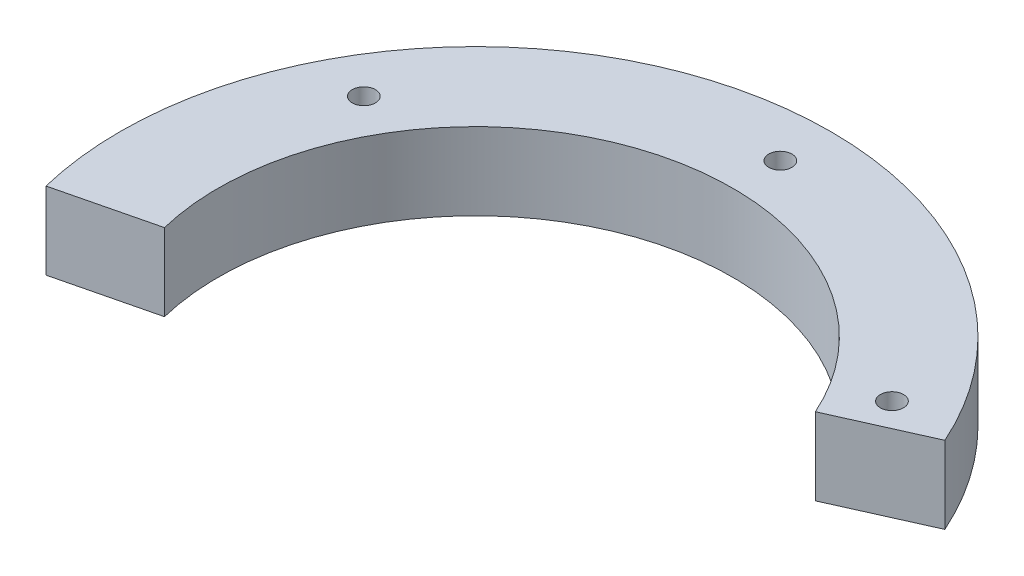
ISO-10303-21;
HEADER;
FILE_DESCRIPTION(('STEP AP214'),'2;1');
FILE_NAME('part.step','',(''),(''),'','','');
FILE_SCHEMA(('AUTOMOTIVE_DESIGN { 1 0 10303 214 1 1 1 1 }'));
ENDSEC;
DATA;
#1=APPLICATION_CONTEXT('core data for automotive mechanical design processes');
#2=APPLICATION_PROTOCOL_DEFINITION('international standard','automotive_design',2000,#1);
#3=PRODUCT_CONTEXT('',#1,'mechanical');
#4=PRODUCT('Part','Part','',(#3));
#5=PRODUCT_RELATED_PRODUCT_CATEGORY('part','',(#4));
#6=PRODUCT_DEFINITION_FORMATION('','',#4);
#7=PRODUCT_DEFINITION_CONTEXT('part definition',#1,'design');
#8=PRODUCT_DEFINITION('design','',#6,#7);
#9=PRODUCT_DEFINITION_SHAPE('','',#8);
#10=(LENGTH_UNIT() NAMED_UNIT(*) SI_UNIT(.MILLI.,.METRE.));
#11=(NAMED_UNIT(*) PLANE_ANGLE_UNIT() SI_UNIT($,.RADIAN.));
#12=(NAMED_UNIT(*) SI_UNIT($,.STERADIAN.) SOLID_ANGLE_UNIT());
#13=UNCERTAINTY_MEASURE_WITH_UNIT(LENGTH_MEASURE(1.E-05),#10,'distance_accuracy_value','');
#14=(GEOMETRIC_REPRESENTATION_CONTEXT(3) GLOBAL_UNCERTAINTY_ASSIGNED_CONTEXT((#13)) GLOBAL_UNIT_ASSIGNED_CONTEXT((#10,
#11,#12)) REPRESENTATION_CONTEXT('',''));
#15=CARTESIAN_POINT('',(0.,0.,0.));
#16=DIRECTION('',(0.,0.,1.));
#17=DIRECTION('',(1.,0.,0.));
#18=AXIS2_PLACEMENT_3D('',#15,#16,#17);
#19=CARTESIAN_POINT('',(0.,10.,0.));
#20=DIRECTION('',(0.,1.,0.));
#21=DIRECTION('',(0.,0.,1.));
#22=AXIS2_PLACEMENT_3D('',#19,#20,#21);
#23=PLANE('',#22);
#24=DIRECTION('',(-0.912945914801047,0.,0.408080576171031));
#25=VECTOR('',#24,1.);
#26=CARTESIAN_POINT('',(0.,10.,0.));
#27=LINE('',#26,#25);
#28=CARTESIAN_POINT('',(42.0297475526532,10.,-18.7870095254738));
#29=VERTEX_POINT('',#28);
#30=CARTESIAN_POINT('',(30.4353344346799,10.,-13.6043862081017));
#31=VERTEX_POINT('',#30);
#32=EDGE_CURVE('E61',#29,#31,#27,.T.);
#33=ORIENTED_EDGE('',*,*,#32,.F.);
#34=CARTESIAN_POINT('',(0.,10.,0.));
#35=DIRECTION('',(0.,1.,0.));
#36=DIRECTION('',(0.,0.,1.));
#37=AXIS2_PLACEMENT_3D('',#34,#35,#36);
#38=CIRCLE('',#37,46.0375);
#39=CARTESIAN_POINT('',(-44.726164080436,10.,10.9097045285342));
#40=VERTEX_POINT('',#39);
#41=EDGE_CURVE('E99',#29,#40,#38,.T.);
#42=ORIENTED_EDGE('',*,*,#41,.T.);
#43=DIRECTION('',(-0.971515918119706,0.,0.236974304176686));
#44=VECTOR('',#43,1.);
#45=CARTESIAN_POINT('',(0.,10.,0.));
#46=LINE('',#45,#44);
#47=CARTESIAN_POINT('',(-32.3879119203157,10.,7.90013086549027));
#48=VERTEX_POINT('',#47);
#49=EDGE_CURVE('E80',#48,#40,#46,.T.);
#50=ORIENTED_EDGE('',*,*,#49,.F.);
#51=CARTESIAN_POINT('',(0.,10.,0.));
#52=DIRECTION('',(0.,1.,0.));
#53=DIRECTION('',(0.,0.,1.));
#54=AXIS2_PLACEMENT_3D('',#51,#52,#53);
#55=CIRCLE('',#54,33.3375);
#56=EDGE_CURVE('E112',#31,#48,#55,.T.);
#57=ORIENTED_EDGE('',*,*,#56,.F.);
#58=EDGE_LOOP('',(#33,#42,#50,#57));
#59=FACE_BOUND('',#58,.T.);
#60=CARTESIAN_POINT('',(0.,10.,-39.5));
#61=DIRECTION('',(0.,1.,0.));
#62=DIRECTION('',(0.,0.,1.));
#63=AXIS2_PLACEMENT_3D('',#60,#61,#62);
#64=CIRCLE('',#63,1.5);
#65=CARTESIAN_POINT('',(0.,10.,-38.));
#66=VERTEX_POINT('',#65);
#67=EDGE_CURVE('E100',#66,#66,#64,.T.);
#68=ORIENTED_EDGE('',*,*,#67,.F.);
#69=EDGE_LOOP('',(#68));
#70=FACE_BOUND('',#69,.T.);
#71=CARTESIAN_POINT('',(34.2080034494853,10.,-19.75));
#72=DIRECTION('',(0.,1.,0.));
#73=DIRECTION('',(0.,0.,1.));
#74=AXIS2_PLACEMENT_3D('',#71,#72,#73);
#75=CIRCLE('',#74,1.5);
#76=CARTESIAN_POINT('',(34.2080034494853,10.,-18.25));
#77=VERTEX_POINT('',#76);
#78=EDGE_CURVE('E117',#77,#77,#75,.T.);
#79=ORIENTED_EDGE('',*,*,#78,.F.);
#80=EDGE_LOOP('',(#79));
#81=FACE_BOUND('',#80,.T.);
#82=CARTESIAN_POINT('',(-34.2080034494853,10.,-19.75));
#83=DIRECTION('',(0.,1.,0.));
#84=DIRECTION('',(0.,0.,1.));
#85=AXIS2_PLACEMENT_3D('',#82,#83,#84);
#86=CIRCLE('',#85,1.5);
#87=CARTESIAN_POINT('',(-34.2080034494853,10.,-18.25));
#88=VERTEX_POINT('',#87);
#89=EDGE_CURVE('E123',#88,#88,#86,.T.);
#90=ORIENTED_EDGE('',*,*,#89,.F.);
#91=EDGE_LOOP('',(#90));
#92=FACE_BOUND('',#91,.T.);
#93=ADVANCED_FACE('F39',(#59,#70,#81,#92),#23,.T.);
#94=CARTESIAN_POINT('',(0.,0.,0.));
#95=DIRECTION('',(0.,1.,0.));
#96=DIRECTION('',(0.,0.,1.));
#97=AXIS2_PLACEMENT_3D('',#94,#95,#96);
#98=PLANE('',#97);
#99=CARTESIAN_POINT('',(0.,0.,-39.5));
#100=DIRECTION('',(0.,1.,0.));
#101=DIRECTION('',(0.,0.,1.));
#102=AXIS2_PLACEMENT_3D('',#99,#100,#101);
#103=CIRCLE('',#102,1.5);
#104=CARTESIAN_POINT('',(0.,0.,-38.));
#105=VERTEX_POINT('',#104);
#106=EDGE_CURVE('E104',#105,#105,#103,.T.);
#107=ORIENTED_EDGE('',*,*,#106,.T.);
#108=EDGE_LOOP('',(#107));
#109=FACE_BOUND('',#108,.T.);
#110=CARTESIAN_POINT('',(0.,0.,0.));
#111=DIRECTION('',(0.,1.,0.));
#112=DIRECTION('',(0.,0.,1.));
#113=AXIS2_PLACEMENT_3D('',#110,#111,#112);
#114=CIRCLE('',#113,46.0375);
#115=CARTESIAN_POINT('',(42.0297475526532,0.,-18.7870095254738));
#116=VERTEX_POINT('',#115);
#117=CARTESIAN_POINT('',(-44.726164080436,0.,10.9097045285342));
#118=VERTEX_POINT('',#117);
#119=EDGE_CURVE('E93',#116,#118,#114,.T.);
#120=ORIENTED_EDGE('',*,*,#119,.F.);
#121=DIRECTION('',(-0.912945914801047,0.,0.408080576171031));
#122=VECTOR('',#121,1.);
#123=CARTESIAN_POINT('',(0.,0.,0.));
#124=LINE('',#123,#122);
#125=CARTESIAN_POINT('',(30.4353344346799,0.,-13.6043862081017));
#126=VERTEX_POINT('',#125);
#127=EDGE_CURVE('E96',#116,#126,#124,.T.);
#128=ORIENTED_EDGE('',*,*,#127,.T.);
#129=CARTESIAN_POINT('',(0.,0.,0.));
#130=DIRECTION('',(0.,1.,0.));
#131=DIRECTION('',(0.,0.,1.));
#132=AXIS2_PLACEMENT_3D('',#129,#130,#131);
#133=CIRCLE('',#132,33.3375);
#134=CARTESIAN_POINT('',(-32.3879119203157,0.,7.90013086549027));
#135=VERTEX_POINT('',#134);
#136=EDGE_CURVE('E95',#126,#135,#133,.T.);
#137=ORIENTED_EDGE('',*,*,#136,.T.);
#138=DIRECTION('',(-0.971515918119706,0.,0.236974304176686));
#139=VECTOR('',#138,1.);
#140=CARTESIAN_POINT('',(0.,0.,0.));
#141=LINE('',#140,#139);
#142=EDGE_CURVE('E54',#135,#118,#141,.T.);
#143=ORIENTED_EDGE('',*,*,#142,.T.);
#144=EDGE_LOOP('',(#120,#128,#137,#143));
#145=FACE_BOUND('',#144,.T.);
#146=CARTESIAN_POINT('',(34.2080034494853,0.,-19.75));
#147=DIRECTION('',(0.,1.,0.));
#148=DIRECTION('',(0.,0.,1.));
#149=AXIS2_PLACEMENT_3D('',#146,#147,#148);
#150=CIRCLE('',#149,1.5);
#151=CARTESIAN_POINT('',(34.2080034494853,0.,-18.25));
#152=VERTEX_POINT('',#151);
#153=EDGE_CURVE('E120',#152,#152,#150,.T.);
#154=ORIENTED_EDGE('',*,*,#153,.T.);
#155=EDGE_LOOP('',(#154));
#156=FACE_BOUND('',#155,.T.);
#157=CARTESIAN_POINT('',(-34.2080034494853,0.,-19.75));
#158=DIRECTION('',(0.,1.,0.));
#159=DIRECTION('',(0.,0.,1.));
#160=AXIS2_PLACEMENT_3D('',#157,#158,#159);
#161=CIRCLE('',#160,1.5);
#162=CARTESIAN_POINT('',(-34.2080034494853,0.,-18.25));
#163=VERTEX_POINT('',#162);
#164=EDGE_CURVE('E126',#163,#163,#161,.T.);
#165=ORIENTED_EDGE('',*,*,#164,.T.);
#166=EDGE_LOOP('',(#165));
#167=FACE_BOUND('',#166,.T.);
#168=ADVANCED_FACE('F90',(#109,#145,#156,#167),#98,.F.);
#169=CARTESIAN_POINT('',(0.,10.,0.));
#170=DIRECTION('',(0.,-1.,0.));
#171=DIRECTION('',(0.,0.,-1.));
#172=AXIS2_PLACEMENT_3D('',#169,#170,#171);
#173=CYLINDRICAL_SURFACE('',#172,46.0375);
#174=ORIENTED_EDGE('',*,*,#41,.F.);
#175=DIRECTION('',(0.,1.,0.));
#176=VECTOR('',#175,1.);
#177=CARTESIAN_POINT('',(42.0297475526532,0.,-18.7870095254738));
#178=LINE('',#177,#176);
#179=EDGE_CURVE('E85',#116,#29,#178,.T.);
#180=ORIENTED_EDGE('',*,*,#179,.F.);
#181=ORIENTED_EDGE('',*,*,#119,.T.);
#182=DIRECTION('',(0.,1.,0.));
#183=VECTOR('',#182,1.);
#184=CARTESIAN_POINT('',(-44.726164080436,0.,10.9097045285342));
#185=LINE('',#184,#183);
#186=EDGE_CURVE('E77',#118,#40,#185,.T.);
#187=ORIENTED_EDGE('',*,*,#186,.T.);
#188=EDGE_LOOP('',(#174,#180,#181,#187));
#189=FACE_BOUND('',#188,.T.);
#190=ADVANCED_FACE('F41',(#189),#173,.T.);
#191=CARTESIAN_POINT('',(0.,10.,-39.5));
#192=DIRECTION('',(0.,-1.,0.));
#193=DIRECTION('',(0.,0.,-1.));
#194=AXIS2_PLACEMENT_3D('',#191,#192,#193);
#195=CYLINDRICAL_SURFACE('',#194,1.5);
#196=ORIENTED_EDGE('',*,*,#67,.T.);
#197=EDGE_LOOP('',(#196));
#198=FACE_BOUND('',#197,.T.);
#199=ORIENTED_EDGE('',*,*,#106,.F.);
#200=EDGE_LOOP('',(#199));
#201=FACE_BOUND('',#200,.T.);
#202=ADVANCED_FACE('F150',(#198,#201),#195,.F.);
#203=CARTESIAN_POINT('',(0.,10.,0.));
#204=DIRECTION('',(0.,-1.,0.));
#205=DIRECTION('',(0.,0.,-1.));
#206=AXIS2_PLACEMENT_3D('',#203,#204,#205);
#207=CYLINDRICAL_SURFACE('',#206,33.3375);
#208=DIRECTION('',(0.,-1.,0.));
#209=VECTOR('',#208,1.);
#210=CARTESIAN_POINT('',(30.4353344346799,10.,-13.6043862081017));
#211=LINE('',#210,#209);
#212=EDGE_CURVE('E11',#31,#126,#211,.T.);
#213=ORIENTED_EDGE('',*,*,#212,.F.);
#214=ORIENTED_EDGE('',*,*,#56,.T.);
#215=DIRECTION('',(0.,-1.,0.));
#216=VECTOR('',#215,1.);
#217=CARTESIAN_POINT('',(-32.3879119203157,10.,7.90013086549027));
#218=LINE('',#217,#216);
#219=EDGE_CURVE('E47',#135,#48,#218,.F.);
#220=ORIENTED_EDGE('',*,*,#219,.F.);
#221=ORIENTED_EDGE('',*,*,#136,.F.);
#222=EDGE_LOOP('',(#213,#214,#220,#221));
#223=FACE_BOUND('',#222,.T.);
#224=ADVANCED_FACE('F114',(#223),#207,.F.);
#225=CARTESIAN_POINT('',(34.2080034494853,10.,-19.75));
#226=DIRECTION('',(0.,-1.,0.));
#227=DIRECTION('',(0.,0.,-1.));
#228=AXIS2_PLACEMENT_3D('',#225,#226,#227);
#229=CYLINDRICAL_SURFACE('',#228,1.5);
#230=ORIENTED_EDGE('',*,*,#78,.T.);
#231=EDGE_LOOP('',(#230));
#232=FACE_BOUND('',#231,.T.);
#233=ORIENTED_EDGE('',*,*,#153,.F.);
#234=EDGE_LOOP('',(#233));
#235=FACE_BOUND('',#234,.T.);
#236=ADVANCED_FACE('F156',(#232,#235),#229,.F.);
#237=CARTESIAN_POINT('',(-34.2080034494853,10.,-19.75));
#238=DIRECTION('',(0.,-1.,0.));
#239=DIRECTION('',(0.,0.,-1.));
#240=AXIS2_PLACEMENT_3D('',#237,#238,#239);
#241=CYLINDRICAL_SURFACE('',#240,1.5);
#242=ORIENTED_EDGE('',*,*,#89,.T.);
#243=EDGE_LOOP('',(#242));
#244=FACE_BOUND('',#243,.T.);
#245=ORIENTED_EDGE('',*,*,#164,.F.);
#246=EDGE_LOOP('',(#245));
#247=FACE_BOUND('',#246,.T.);
#248=ADVANCED_FACE('F139',(#244,#247),#241,.F.);
#249=CARTESIAN_POINT('',(0.,0.,0.));
#250=DIRECTION('',(-0.236974304176686,0.,-0.971515918119706));
#251=DIRECTION('',(-0.971515918119706,0.,0.236974304176686));
#252=AXIS2_PLACEMENT_3D('',#249,#250,#251);
#253=PLANE('',#252);
#254=ORIENTED_EDGE('',*,*,#219,.T.);
#255=ORIENTED_EDGE('',*,*,#49,.T.);
#256=ORIENTED_EDGE('',*,*,#186,.F.);
#257=ORIENTED_EDGE('',*,*,#142,.F.);
#258=EDGE_LOOP('',(#254,#255,#256,#257));
#259=FACE_BOUND('',#258,.T.);
#260=ADVANCED_FACE('F78',(#259),#253,.F.);
#261=CARTESIAN_POINT('',(0.,0.,0.));
#262=DIRECTION('',(-0.408080576171031,0.,-0.912945914801047));
#263=DIRECTION('',(-0.912945914801047,0.,0.408080576171031));
#264=AXIS2_PLACEMENT_3D('',#261,#262,#263);
#265=PLANE('',#264);
#266=ORIENTED_EDGE('',*,*,#212,.T.);
#267=ORIENTED_EDGE('',*,*,#127,.F.);
#268=ORIENTED_EDGE('',*,*,#179,.T.);
#269=ORIENTED_EDGE('',*,*,#32,.T.);
#270=EDGE_LOOP('',(#266,#267,#268,#269));
#271=FACE_BOUND('',#270,.T.);
#272=ADVANCED_FACE('F133',(#271),#265,.F.);
#273=CLOSED_SHELL('',(#93,#168,#190,#202,#224,#236,#248,#260,#272));
#274=MANIFOLD_SOLID_BREP('B2',#273);
#275=ADVANCED_BREP_SHAPE_REPRESENTATION('',(#18,#274),#14);
#276=SHAPE_DEFINITION_REPRESENTATION(#9,#275);
ENDSEC;
END-ISO-10303-21;
